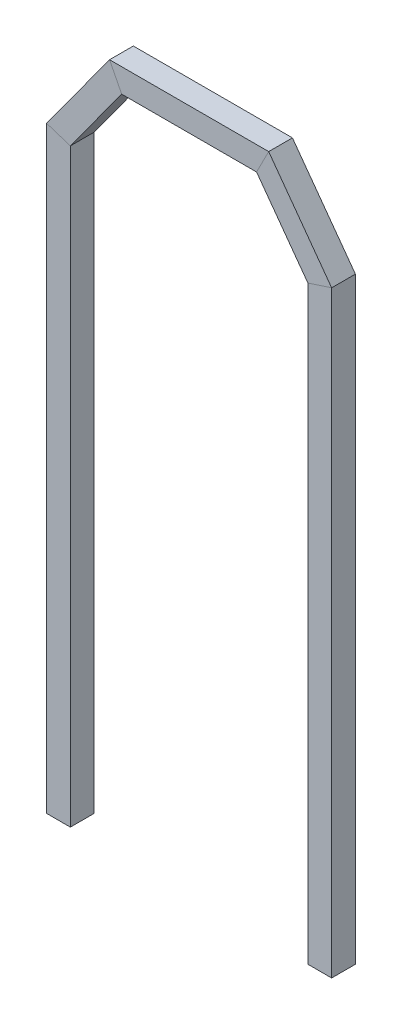
ISO-10303-21;
HEADER;
FILE_DESCRIPTION(('STEP AP214'),'2;1');
FILE_NAME('part.step','',(''),(''),'','','');
FILE_SCHEMA(('AUTOMOTIVE_DESIGN { 1 0 10303 214 1 1 1 1 }'));
ENDSEC;
DATA;
#1=APPLICATION_CONTEXT('core data for automotive mechanical design processes');
#2=APPLICATION_PROTOCOL_DEFINITION('international standard','automotive_design',2000,#1);
#3=PRODUCT_CONTEXT('',#1,'mechanical');
#4=PRODUCT('Part','Part','',(#3));
#5=PRODUCT_RELATED_PRODUCT_CATEGORY('part','',(#4));
#6=PRODUCT_DEFINITION_FORMATION('','',#4);
#7=PRODUCT_DEFINITION_CONTEXT('part definition',#1,'design');
#8=PRODUCT_DEFINITION('design','',#6,#7);
#9=PRODUCT_DEFINITION_SHAPE('','',#8);
#10=(LENGTH_UNIT() NAMED_UNIT(*) SI_UNIT(.MILLI.,.METRE.));
#11=(NAMED_UNIT(*) PLANE_ANGLE_UNIT() SI_UNIT($,.RADIAN.));
#12=(NAMED_UNIT(*) SI_UNIT($,.STERADIAN.) SOLID_ANGLE_UNIT());
#13=UNCERTAINTY_MEASURE_WITH_UNIT(LENGTH_MEASURE(1.E-05),#10,'distance_accuracy_value','');
#14=(GEOMETRIC_REPRESENTATION_CONTEXT(3) GLOBAL_UNCERTAINTY_ASSIGNED_CONTEXT((#13)) GLOBAL_UNIT_ASSIGNED_CONTEXT((#10,
#11,#12)) REPRESENTATION_CONTEXT('',''));
#15=CARTESIAN_POINT('',(0.,0.,0.));
#16=DIRECTION('',(0.,0.,1.));
#17=DIRECTION('',(1.,0.,0.));
#18=AXIS2_PLACEMENT_3D('',#15,#16,#17);
#19=CARTESIAN_POINT('',(202.567137450649,1728.2833819242,30.));
#20=DIRECTION('',(0.,1.,0.));
#21=DIRECTION('',(0.,0.,1.));
#22=AXIS2_PLACEMENT_3D('',#19,#20,#21);
#23=PLANE('',#22);
#24=DIRECTION('',(0.,0.,1.));
#25=VECTOR('',#24,1.);
#26=CARTESIAN_POINT('',(200.940228321157,1728.2833819242,30.));
#27=LINE('',#26,#25);
#28=CARTESIAN_POINT('',(200.940228321157,1728.2833819242,-30.));
#29=VERTEX_POINT('',#28);
#30=CARTESIAN_POINT('',(200.940228321157,1728.2833819242,30.));
#31=VERTEX_POINT('',#30);
#32=EDGE_CURVE('E169',#29,#31,#27,.T.);
#33=ORIENTED_EDGE('',*,*,#32,.F.);
#34=DIRECTION('',(-1.,0.,0.));
#35=VECTOR('',#34,1.);
#36=CARTESIAN_POINT('',(202.567137450649,1728.2833819242,-30.));
#37=LINE('',#36,#35);
#38=CARTESIAN_POINT('',(-200.940228321157,1728.2833819242,-30.));
#39=VERTEX_POINT('',#38);
#40=EDGE_CURVE('E127',#29,#39,#37,.T.);
#41=ORIENTED_EDGE('',*,*,#40,.T.);
#42=DIRECTION('',(0.,0.,-1.));
#43=VECTOR('',#42,1.);
#44=CARTESIAN_POINT('',(-200.940228321157,1728.2833819242,30.));
#45=LINE('',#44,#43);
#46=CARTESIAN_POINT('',(-200.940228321157,1728.2833819242,30.));
#47=VERTEX_POINT('',#46);
#48=EDGE_CURVE('E191',#47,#39,#45,.T.);
#49=ORIENTED_EDGE('',*,*,#48,.F.);
#50=DIRECTION('',(-1.,0.,0.));
#51=VECTOR('',#50,1.);
#52=CARTESIAN_POINT('',(202.567137450649,1728.2833819242,30.));
#53=LINE('',#52,#51);
#54=EDGE_CURVE('E43',#31,#47,#53,.T.);
#55=ORIENTED_EDGE('',*,*,#54,.F.);
#56=EDGE_LOOP('',(#33,#41,#49,#55));
#57=FACE_BOUND('',#56,.T.);
#58=ADVANCED_FACE('F39',(#57),#23,.T.);
#59=CARTESIAN_POINT('',(202.567137450649,1668.2833819242,-30.));
#60=DIRECTION('',(0.,0.,-1.));
#61=DIRECTION('',(-1.,0.,0.));
#62=AXIS2_PLACEMENT_3D('',#59,#60,#61);
#63=PLANE('',#62);
#64=DIRECTION('',(0.45359725722166,0.891206781976544,0.));
#65=VECTOR('',#64,1.);
#66=CARTESIAN_POINT('',(120.853534069389,1570.93277204523,-30.));
#67=LINE('',#66,#65);
#68=CARTESIAN_POINT('',(170.402045731321,1668.2833819242,-30.));
#69=VERTEX_POINT('',#68);
#70=EDGE_CURVE('E120',#69,#29,#67,.T.);
#71=ORIENTED_EDGE('',*,*,#70,.F.);
#72=DIRECTION('',(-1.,0.,0.));
#73=VECTOR('',#72,1.);
#74=CARTESIAN_POINT('',(202.567137450649,1668.2833819242,-30.));
#75=LINE('',#74,#73);
#76=CARTESIAN_POINT('',(-170.402045731321,1668.2833819242,-30.));
#77=VERTEX_POINT('',#76);
#78=EDGE_CURVE('E124',#69,#77,#75,.T.);
#79=ORIENTED_EDGE('',*,*,#78,.T.);
#80=DIRECTION('',(0.45359725722166,-0.891206781976544,0.));
#81=VECTOR('',#80,1.);
#82=CARTESIAN_POINT('',(-120.853534069389,1570.93277204523,-30.));
#83=LINE('',#82,#81);
#84=EDGE_CURVE('E197',#39,#77,#83,.T.);
#85=ORIENTED_EDGE('',*,*,#84,.F.);
#86=ORIENTED_EDGE('',*,*,#40,.F.);
#87=EDGE_LOOP('',(#71,#79,#85,#86));
#88=FACE_BOUND('',#87,.T.);
#89=ADVANCED_FACE('F121',(#88),#63,.T.);
#90=CARTESIAN_POINT('',(202.567137450649,1668.2833819242,30.));
#91=DIRECTION('',(0.,-1.,0.));
#92=DIRECTION('',(0.,0.,-1.));
#93=AXIS2_PLACEMENT_3D('',#90,#91,#92);
#94=PLANE('',#93);
#95=DIRECTION('',(0.,0.,-1.));
#96=VECTOR('',#95,1.);
#97=CARTESIAN_POINT('',(170.402045731321,1668.2833819242,30.));
#98=LINE('',#97,#96);
#99=CARTESIAN_POINT('',(170.402045731321,1668.2833819242,30.));
#100=VERTEX_POINT('',#99);
#101=EDGE_CURVE('E113',#100,#69,#98,.T.);
#102=ORIENTED_EDGE('',*,*,#101,.F.);
#103=DIRECTION('',(-1.,0.,0.));
#104=VECTOR('',#103,1.);
#105=CARTESIAN_POINT('',(202.567137450649,1668.2833819242,30.));
#106=LINE('',#105,#104);
#107=CARTESIAN_POINT('',(-170.402045731321,1668.2833819242,30.));
#108=VERTEX_POINT('',#107);
#109=EDGE_CURVE('E140',#100,#108,#106,.T.);
#110=ORIENTED_EDGE('',*,*,#109,.T.);
#111=DIRECTION('',(0.,0.,1.));
#112=VECTOR('',#111,1.);
#113=CARTESIAN_POINT('',(-170.402045731321,1668.2833819242,30.));
#114=LINE('',#113,#112);
#115=EDGE_CURVE('E137',#77,#108,#114,.T.);
#116=ORIENTED_EDGE('',*,*,#115,.F.);
#117=ORIENTED_EDGE('',*,*,#78,.F.);
#118=EDGE_LOOP('',(#102,#110,#116,#117));
#119=FACE_BOUND('',#118,.T.);
#120=ADVANCED_FACE('F135',(#119),#94,.T.);
#121=CARTESIAN_POINT('',(202.567137450649,1668.2833819242,30.));
#122=DIRECTION('',(0.,0.,1.));
#123=DIRECTION('',(1.,0.,0.));
#124=AXIS2_PLACEMENT_3D('',#121,#122,#123);
#125=PLANE('',#124);
#126=DIRECTION('',(-0.45359725722166,-0.891206781976544,0.));
#127=VECTOR('',#126,1.);
#128=CARTESIAN_POINT('',(120.853534069389,1570.93277204523,30.));
#129=LINE('',#128,#127);
#130=EDGE_CURVE('E151',#31,#100,#129,.T.);
#131=ORIENTED_EDGE('',*,*,#130,.F.);
#132=ORIENTED_EDGE('',*,*,#54,.T.);
#133=DIRECTION('',(-0.45359725722166,0.891206781976544,0.));
#134=VECTOR('',#133,1.);
#135=CARTESIAN_POINT('',(-120.853534069389,1570.93277204523,30.));
#136=LINE('',#135,#134);
#137=EDGE_CURVE('E187',#108,#47,#136,.T.);
#138=ORIENTED_EDGE('',*,*,#137,.F.);
#139=ORIENTED_EDGE('',*,*,#109,.F.);
#140=EDGE_LOOP('',(#131,#132,#138,#139));
#141=FACE_BOUND('',#140,.T.);
#142=ADVANCED_FACE('F41',(#141),#125,.T.);
#143=CARTESIAN_POINT('',(312.123481963488,1473.58216216625,30.));
#144=DIRECTION('',(0.,0.,1.));
#145=DIRECTION('',(1.,0.,0.));
#146=AXIS2_PLACEMENT_3D('',#143,#144,#145);
#147=PLANE('',#146);
#148=DIRECTION('',(-0.588499056481974,0.808497903843805,0.));
#149=VECTOR('',#148,1.);
#150=CARTESIAN_POINT('',(360.633356194117,1508.89210555517,30.));
#151=LINE('',#150,#149);
#152=CARTESIAN_POINT('',(360.,1509.76222955909,30.));
#153=VERTEX_POINT('',#152);
#154=EDGE_CURVE('E161',#153,#31,#151,.T.);
#155=ORIENTED_EDGE('',*,*,#154,.T.);
#156=ORIENTED_EDGE('',*,*,#130,.T.);
#157=DIRECTION('',(-0.588499056481974,0.808497903843805,0.));
#158=VECTOR('',#157,1.);
#159=CARTESIAN_POINT('',(312.123481963488,1473.58216216625,30.));
#160=LINE('',#159,#158);
#161=CARTESIAN_POINT('',(300.,1490.23777044091,30.));
#162=VERTEX_POINT('',#161);
#163=EDGE_CURVE('E149',#162,#100,#160,.T.);
#164=ORIENTED_EDGE('',*,*,#163,.F.);
#165=DIRECTION('',(-0.95092005548411,-0.309436662466,0.));
#166=VECTOR('',#165,1.);
#167=CARTESIAN_POINT('',(-138.501760919138,1347.54594203562,30.));
#168=LINE('',#167,#166);
#169=EDGE_CURVE('E336',#153,#162,#168,.T.);
#170=ORIENTED_EDGE('',*,*,#169,.F.);
#171=EDGE_LOOP('',(#155,#156,#164,#170));
#172=FACE_BOUND('',#171,.T.);
#173=ADVANCED_FACE('F360',(#172),#147,.T.);
#174=CARTESIAN_POINT('',(312.123481963488,1473.58216216625,30.));
#175=DIRECTION('',(-0.808497903843805,-0.588499056481974,0.));
#176=DIRECTION('',(0.588499056481974,-0.808497903843805,0.));
#177=AXIS2_PLACEMENT_3D('',#174,#175,#176);
#178=PLANE('',#177);
#179=ORIENTED_EDGE('',*,*,#163,.T.);
#180=ORIENTED_EDGE('',*,*,#101,.T.);
#181=DIRECTION('',(-0.588499056481974,0.808497903843805,0.));
#182=VECTOR('',#181,1.);
#183=CARTESIAN_POINT('',(312.123481963488,1473.58216216625,-30.));
#184=LINE('',#183,#182);
#185=CARTESIAN_POINT('',(300.,1490.23777044091,-30.));
#186=VERTEX_POINT('',#185);
#187=EDGE_CURVE('E146',#186,#69,#184,.T.);
#188=ORIENTED_EDGE('',*,*,#187,.F.);
#189=DIRECTION('',(0.,0.,-1.));
#190=VECTOR('',#189,1.);
#191=CARTESIAN_POINT('',(300.,1490.23777044091,30.));
#192=LINE('',#191,#190);
#193=EDGE_CURVE('E333',#162,#186,#192,.T.);
#194=ORIENTED_EDGE('',*,*,#193,.F.);
#195=EDGE_LOOP('',(#179,#180,#188,#194));
#196=FACE_BOUND('',#195,.T.);
#197=ADVANCED_FACE('F145',(#196),#178,.T.);
#198=CARTESIAN_POINT('',(312.123481963488,1473.58216216625,-30.));
#199=DIRECTION('',(0.,0.,-1.));
#200=DIRECTION('',(-1.,0.,0.));
#201=AXIS2_PLACEMENT_3D('',#198,#199,#200);
#202=PLANE('',#201);
#203=ORIENTED_EDGE('',*,*,#187,.T.);
#204=ORIENTED_EDGE('',*,*,#70,.T.);
#205=DIRECTION('',(-0.588499056481974,0.808497903843805,0.));
#206=VECTOR('',#205,1.);
#207=CARTESIAN_POINT('',(360.633356194117,1508.89210555517,-30.));
#208=LINE('',#207,#206);
#209=CARTESIAN_POINT('',(360.,1509.76222955909,-30.));
#210=VERTEX_POINT('',#209);
#211=EDGE_CURVE('E157',#210,#29,#208,.T.);
#212=ORIENTED_EDGE('',*,*,#211,.F.);
#213=DIRECTION('',(0.95092005548411,0.309436662466,0.));
#214=VECTOR('',#213,1.);
#215=CARTESIAN_POINT('',(-138.501760919138,1347.54594203562,-30.));
#216=LINE('',#215,#214);
#217=EDGE_CURVE('E155',#186,#210,#216,.T.);
#218=ORIENTED_EDGE('',*,*,#217,.F.);
#219=EDGE_LOOP('',(#203,#204,#212,#218));
#220=FACE_BOUND('',#219,.T.);
#221=ADVANCED_FACE('F153',(#220),#202,.T.);
#222=CARTESIAN_POINT('',(360.633356194117,1508.89210555517,30.));
#223=DIRECTION('',(0.808497903843805,0.588499056481974,0.));
#224=DIRECTION('',(-0.588499056481974,0.808497903843805,0.));
#225=AXIS2_PLACEMENT_3D('',#222,#223,#224);
#226=PLANE('',#225);
#227=ORIENTED_EDGE('',*,*,#211,.T.);
#228=ORIENTED_EDGE('',*,*,#32,.T.);
#229=ORIENTED_EDGE('',*,*,#154,.F.);
#230=DIRECTION('',(0.,0.,1.));
#231=VECTOR('',#230,1.);
#232=CARTESIAN_POINT('',(360.,1509.76222955909,30.));
#233=LINE('',#232,#231);
#234=EDGE_CURVE('E340',#210,#153,#233,.T.);
#235=ORIENTED_EDGE('',*,*,#234,.F.);
#236=EDGE_LOOP('',(#227,#228,#229,#235));
#237=FACE_BOUND('',#236,.T.);
#238=ADVANCED_FACE('F363',(#237),#226,.T.);
#239=CARTESIAN_POINT('',(300.,0.,30.));
#240=DIRECTION('',(0.,0.,1.));
#241=DIRECTION('',(1.,0.,0.));
#242=AXIS2_PLACEMENT_3D('',#239,#240,#241);
#243=PLANE('',#242);
#244=DIRECTION('',(0.,1.,0.));
#245=VECTOR('',#244,1.);
#246=CARTESIAN_POINT('',(360.,0.,30.));
#247=LINE('',#246,#245);
#248=CARTESIAN_POINT('',(360.,0.,30.));
#249=VERTEX_POINT('',#248);
#250=EDGE_CURVE('E133',#249,#153,#247,.T.);
#251=ORIENTED_EDGE('',*,*,#250,.T.);
#252=ORIENTED_EDGE('',*,*,#169,.T.);
#253=DIRECTION('',(0.,1.,0.));
#254=VECTOR('',#253,1.);
#255=CARTESIAN_POINT('',(300.,0.,30.));
#256=LINE('',#255,#254);
#257=CARTESIAN_POINT('',(300.,0.,30.));
#258=VERTEX_POINT('',#257);
#259=EDGE_CURVE('E352',#258,#162,#256,.T.);
#260=ORIENTED_EDGE('',*,*,#259,.F.);
#261=DIRECTION('',(1.,0.,0.));
#262=VECTOR('',#261,1.);
#263=CARTESIAN_POINT('',(300.,0.,30.));
#264=LINE('',#263,#262);
#265=EDGE_CURVE('E309',#258,#249,#264,.T.);
#266=ORIENTED_EDGE('',*,*,#265,.T.);
#267=EDGE_LOOP('',(#251,#252,#260,#266));
#268=FACE_BOUND('',#267,.T.);
#269=ADVANCED_FACE('F370',(#268),#243,.T.);
#270=CARTESIAN_POINT('',(300.,0.,30.));
#271=DIRECTION('',(-1.,0.,0.));
#272=DIRECTION('',(0.,0.,1.));
#273=AXIS2_PLACEMENT_3D('',#270,#271,#272);
#274=PLANE('',#273);
#275=ORIENTED_EDGE('',*,*,#259,.T.);
#276=ORIENTED_EDGE('',*,*,#193,.T.);
#277=DIRECTION('',(0.,1.,0.));
#278=VECTOR('',#277,1.);
#279=CARTESIAN_POINT('',(300.,0.,-30.));
#280=LINE('',#279,#278);
#281=CARTESIAN_POINT('',(300.,0.,-30.));
#282=VERTEX_POINT('',#281);
#283=EDGE_CURVE('E345',#282,#186,#280,.T.);
#284=ORIENTED_EDGE('',*,*,#283,.F.);
#285=DIRECTION('',(0.,0.,1.));
#286=VECTOR('',#285,1.);
#287=CARTESIAN_POINT('',(300.,0.,30.));
#288=LINE('',#287,#286);
#289=EDGE_CURVE('E322',#282,#258,#288,.T.);
#290=ORIENTED_EDGE('',*,*,#289,.T.);
#291=EDGE_LOOP('',(#275,#276,#284,#290));
#292=FACE_BOUND('',#291,.T.);
#293=ADVANCED_FACE('F382',(#292),#274,.T.);
#294=CARTESIAN_POINT('',(300.,0.,-30.));
#295=DIRECTION('',(0.,0.,-1.));
#296=DIRECTION('',(-1.,0.,0.));
#297=AXIS2_PLACEMENT_3D('',#294,#295,#296);
#298=PLANE('',#297);
#299=ORIENTED_EDGE('',*,*,#283,.T.);
#300=ORIENTED_EDGE('',*,*,#217,.T.);
#301=DIRECTION('',(0.,1.,0.));
#302=VECTOR('',#301,1.);
#303=CARTESIAN_POINT('',(360.,0.,-30.));
#304=LINE('',#303,#302);
#305=CARTESIAN_POINT('',(360.,0.,-30.));
#306=VERTEX_POINT('',#305);
#307=EDGE_CURVE('E341',#306,#210,#304,.T.);
#308=ORIENTED_EDGE('',*,*,#307,.F.);
#309=DIRECTION('',(-1.,0.,0.));
#310=VECTOR('',#309,1.);
#311=CARTESIAN_POINT('',(300.,0.,-30.));
#312=LINE('',#311,#310);
#313=EDGE_CURVE('E326',#306,#282,#312,.T.);
#314=ORIENTED_EDGE('',*,*,#313,.T.);
#315=EDGE_LOOP('',(#299,#300,#308,#314));
#316=FACE_BOUND('',#315,.T.);
#317=ADVANCED_FACE('F379',(#316),#298,.T.);
#318=CARTESIAN_POINT('',(360.,0.,30.));
#319=DIRECTION('',(1.,0.,0.));
#320=DIRECTION('',(0.,0.,-1.));
#321=AXIS2_PLACEMENT_3D('',#318,#319,#320);
#322=PLANE('',#321);
#323=ORIENTED_EDGE('',*,*,#307,.T.);
#324=ORIENTED_EDGE('',*,*,#234,.T.);
#325=ORIENTED_EDGE('',*,*,#250,.F.);
#326=DIRECTION('',(0.,0.,-1.));
#327=VECTOR('',#326,1.);
#328=CARTESIAN_POINT('',(360.,0.,30.));
#329=LINE('',#328,#327);
#330=EDGE_CURVE('E323',#249,#306,#329,.T.);
#331=ORIENTED_EDGE('',*,*,#330,.T.);
#332=EDGE_LOOP('',(#323,#324,#325,#331));
#333=FACE_BOUND('',#332,.T.);
#334=ADVANCED_FACE('F366',(#333),#322,.T.);
#335=CARTESIAN_POINT('',(0.,0.,0.));
#336=DIRECTION('',(0.,-1.,0.));
#337=DIRECTION('',(0.,0.,-1.));
#338=AXIS2_PLACEMENT_3D('',#335,#336,#337);
#339=PLANE('',#338);
#340=ORIENTED_EDGE('',*,*,#330,.F.);
#341=ORIENTED_EDGE('',*,*,#265,.F.);
#342=ORIENTED_EDGE('',*,*,#289,.F.);
#343=ORIENTED_EDGE('',*,*,#313,.F.);
#344=EDGE_LOOP('',(#340,#341,#342,#343));
#345=FACE_BOUND('',#344,.T.);
#346=DIRECTION('',(1.,0.,0.));
#347=VECTOR('',#346,1.);
#348=CARTESIAN_POINT('',(305.,0.,25.));
#349=LINE('',#348,#347);
#350=CARTESIAN_POINT('',(355.,0.,25.));
#351=VERTEX_POINT('',#350);
#352=CARTESIAN_POINT('',(305.,0.,25.));
#353=VERTEX_POINT('',#352);
#354=EDGE_CURVE('E252',#351,#353,#349,.F.);
#355=ORIENTED_EDGE('',*,*,#354,.F.);
#356=DIRECTION('',(0.,0.,-1.));
#357=VECTOR('',#356,1.);
#358=CARTESIAN_POINT('',(355.,0.,25.));
#359=LINE('',#358,#357);
#360=CARTESIAN_POINT('',(355.,0.,-25.));
#361=VERTEX_POINT('',#360);
#362=EDGE_CURVE('E256',#361,#351,#359,.F.);
#363=ORIENTED_EDGE('',*,*,#362,.F.);
#364=DIRECTION('',(-1.,0.,0.));
#365=VECTOR('',#364,1.);
#366=CARTESIAN_POINT('',(305.,0.,-25.));
#367=LINE('',#366,#365);
#368=CARTESIAN_POINT('',(305.,0.,-25.));
#369=VERTEX_POINT('',#368);
#370=EDGE_CURVE('E241',#369,#361,#367,.F.);
#371=ORIENTED_EDGE('',*,*,#370,.F.);
#372=DIRECTION('',(0.,0.,1.));
#373=VECTOR('',#372,1.);
#374=CARTESIAN_POINT('',(305.,0.,25.));
#375=LINE('',#374,#373);
#376=EDGE_CURVE('E237',#353,#369,#375,.F.);
#377=ORIENTED_EDGE('',*,*,#376,.F.);
#378=EDGE_LOOP('',(#355,#363,#371,#377));
#379=FACE_BOUND('',#378,.T.);
#380=ADVANCED_FACE('F375',(#345,#379),#339,.T.);
#381=CARTESIAN_POINT('',(199.76780404658,1673.2833819242,25.));
#382=DIRECTION('',(0.,1.,0.));
#383=DIRECTION('',(0.,0.,1.));
#384=AXIS2_PLACEMENT_3D('',#381,#382,#383);
#385=PLANE('',#384);
#386=DIRECTION('',(0.,0.,1.));
#387=VECTOR('',#386,1.);
#388=CARTESIAN_POINT('',(172.946894280474,1673.2833819242,25.));
#389=LINE('',#388,#387);
#390=CARTESIAN_POINT('',(172.946894280474,1673.2833819242,-25.));
#391=VERTEX_POINT('',#390);
#392=CARTESIAN_POINT('',(172.946894280474,1673.2833819242,25.));
#393=VERTEX_POINT('',#392);
#394=EDGE_CURVE('E284',#391,#393,#389,.T.);
#395=ORIENTED_EDGE('',*,*,#394,.F.);
#396=DIRECTION('',(-1.,0.,0.));
#397=VECTOR('',#396,1.);
#398=CARTESIAN_POINT('',(199.76780404658,1673.2833819242,-25.));
#399=LINE('',#398,#397);
#400=CARTESIAN_POINT('',(-172.946894280474,1673.2833819242,-25.));
#401=VERTEX_POINT('',#400);
#402=EDGE_CURVE('E313',#391,#401,#399,.T.);
#403=ORIENTED_EDGE('',*,*,#402,.T.);
#404=DIRECTION('',(0.,0.,-1.));
#405=VECTOR('',#404,1.);
#406=CARTESIAN_POINT('',(-172.946894280474,1673.2833819242,25.));
#407=LINE('',#406,#405);
#408=CARTESIAN_POINT('',(-172.946894280474,1673.2833819242,25.));
#409=VERTEX_POINT('',#408);
#410=EDGE_CURVE('E830',#409,#401,#407,.T.);
#411=ORIENTED_EDGE('',*,*,#410,.F.);
#412=DIRECTION('',(-1.,0.,0.));
#413=VECTOR('',#412,1.);
#414=CARTESIAN_POINT('',(199.76780404658,1673.2833819242,25.));
#415=LINE('',#414,#413);
#416=EDGE_CURVE('E290',#393,#409,#415,.T.);
#417=ORIENTED_EDGE('',*,*,#416,.F.);
#418=EDGE_LOOP('',(#395,#403,#411,#417));
#419=FACE_BOUND('',#418,.T.);
#420=ADVANCED_FACE('F429',(#419),#385,.T.);
#421=CARTESIAN_POINT('',(199.76780404658,1673.2833819242,-25.));
#422=DIRECTION('',(0.,0.,1.));
#423=DIRECTION('',(1.,0.,0.));
#424=AXIS2_PLACEMENT_3D('',#421,#422,#423);
#425=PLANE('',#424);
#426=DIRECTION('',(-0.45359725722166,-0.891206781976544,0.));
#427=VECTOR('',#426,1.);
#428=CARTESIAN_POINT('',(123.243019107486,1575.62752104884,-25.));
#429=LINE('',#428,#427);
#430=CARTESIAN_POINT('',(198.395379772004,1723.2833819242,-25.));
#431=VERTEX_POINT('',#430);
#432=EDGE_CURVE('E242',#431,#391,#429,.T.);
#433=ORIENTED_EDGE('',*,*,#432,.F.);
#434=DIRECTION('',(-1.,0.,0.));
#435=VECTOR('',#434,1.);
#436=CARTESIAN_POINT('',(199.76780404658,1723.2833819242,-25.));
#437=LINE('',#436,#435);
#438=CARTESIAN_POINT('',(-198.395379772004,1723.2833819242,-25.));
#439=VERTEX_POINT('',#438);
#440=EDGE_CURVE('E308',#431,#439,#437,.T.);
#441=ORIENTED_EDGE('',*,*,#440,.T.);
#442=DIRECTION('',(-0.45359725722166,0.891206781976544,0.));
#443=VECTOR('',#442,1.);
#444=CARTESIAN_POINT('',(-123.243019107486,1575.62752104884,-25.));
#445=LINE('',#444,#443);
#446=EDGE_CURVE('E826',#401,#439,#445,.T.);
#447=ORIENTED_EDGE('',*,*,#446,.F.);
#448=ORIENTED_EDGE('',*,*,#402,.F.);
#449=EDGE_LOOP('',(#433,#441,#447,#448));
#450=FACE_BOUND('',#449,.T.);
#451=ADVANCED_FACE('F432',(#450),#425,.T.);
#452=CARTESIAN_POINT('',(199.76780404658,1723.2833819242,25.));
#453=DIRECTION('',(0.,-1.,0.));
#454=DIRECTION('',(0.,0.,-1.));
#455=AXIS2_PLACEMENT_3D('',#452,#453,#454);
#456=PLANE('',#455);
#457=DIRECTION('',(0.,0.,-1.));
#458=VECTOR('',#457,1.);
#459=CARTESIAN_POINT('',(198.395379772004,1723.2833819242,25.));
#460=LINE('',#459,#458);
#461=CARTESIAN_POINT('',(198.395379772004,1723.2833819242,25.));
#462=VERTEX_POINT('',#461);
#463=EDGE_CURVE('E276',#462,#431,#460,.T.);
#464=ORIENTED_EDGE('',*,*,#463,.F.);
#465=DIRECTION('',(-1.,0.,0.));
#466=VECTOR('',#465,1.);
#467=CARTESIAN_POINT('',(199.76780404658,1723.2833819242,25.));
#468=LINE('',#467,#466);
#469=CARTESIAN_POINT('',(-198.395379772004,1723.2833819242,25.));
#470=VERTEX_POINT('',#469);
#471=EDGE_CURVE('E304',#462,#470,#468,.T.);
#472=ORIENTED_EDGE('',*,*,#471,.T.);
#473=DIRECTION('',(0.,0.,1.));
#474=VECTOR('',#473,1.);
#475=CARTESIAN_POINT('',(-198.395379772004,1723.2833819242,25.));
#476=LINE('',#475,#474);
#477=EDGE_CURVE('E838',#439,#470,#476,.T.);
#478=ORIENTED_EDGE('',*,*,#477,.F.);
#479=ORIENTED_EDGE('',*,*,#440,.F.);
#480=EDGE_LOOP('',(#464,#472,#478,#479));
#481=FACE_BOUND('',#480,.T.);
#482=ADVANCED_FACE('F436',(#481),#456,.T.);
#483=CARTESIAN_POINT('',(199.76780404658,1673.2833819242,25.));
#484=DIRECTION('',(0.,0.,-1.));
#485=DIRECTION('',(-1.,0.,0.));
#486=AXIS2_PLACEMENT_3D('',#483,#484,#485);
#487=PLANE('',#486);
#488=DIRECTION('',(0.45359725722166,0.891206781976544,0.));
#489=VECTOR('',#488,1.);
#490=CARTESIAN_POINT('',(123.243019107486,1575.62752104884,25.));
#491=LINE('',#490,#489);
#492=EDGE_CURVE('E280',#393,#462,#491,.T.);
#493=ORIENTED_EDGE('',*,*,#492,.F.);
#494=ORIENTED_EDGE('',*,*,#416,.T.);
#495=DIRECTION('',(0.45359725722166,-0.891206781976544,0.));
#496=VECTOR('',#495,1.);
#497=CARTESIAN_POINT('',(-123.243019107486,1575.62752104884,25.));
#498=LINE('',#497,#496);
#499=EDGE_CURVE('E834',#470,#409,#498,.T.);
#500=ORIENTED_EDGE('',*,*,#499,.F.);
#501=ORIENTED_EDGE('',*,*,#471,.F.);
#502=EDGE_LOOP('',(#493,#494,#500,#501));
#503=FACE_BOUND('',#502,.T.);
#504=ADVANCED_FACE('F427',(#503),#487,.T.);
#505=CARTESIAN_POINT('',(315.112709953848,1477.97166017348,25.));
#506=DIRECTION('',(0.,0.,-1.));
#507=DIRECTION('',(-1.,0.,0.));
#508=AXIS2_PLACEMENT_3D('',#505,#506,#507);
#509=PLANE('',#508);
#510=DIRECTION('',(-0.588499056481974,0.808497903843805,0.));
#511=VECTOR('',#510,1.);
#512=CARTESIAN_POINT('',(315.112709953848,1477.97166017348,25.));
#513=LINE('',#512,#511);
#514=CARTESIAN_POINT('',(305.,1491.86480870076,25.));
#515=VERTEX_POINT('',#514);
#516=EDGE_CURVE('E297',#515,#393,#513,.T.);
#517=ORIENTED_EDGE('',*,*,#516,.T.);
#518=ORIENTED_EDGE('',*,*,#492,.T.);
#519=DIRECTION('',(-0.588499056481974,0.808497903843805,0.));
#520=VECTOR('',#519,1.);
#521=CARTESIAN_POINT('',(355.537605146039,1507.39661299758,25.));
#522=LINE('',#521,#520);
#523=CARTESIAN_POINT('',(355.,1508.13519129924,25.));
#524=VERTEX_POINT('',#523);
#525=EDGE_CURVE('E285',#524,#462,#522,.T.);
#526=ORIENTED_EDGE('',*,*,#525,.F.);
#527=DIRECTION('',(0.95092005548411,0.309436662466,0.));
#528=VECTOR('',#527,1.);
#529=CARTESIAN_POINT('',(-133.980516159528,1349.01718967683,25.));
#530=LINE('',#529,#528);
#531=EDGE_CURVE('E232',#515,#524,#530,.T.);
#532=ORIENTED_EDGE('',*,*,#531,.F.);
#533=EDGE_LOOP('',(#517,#518,#526,#532));
#534=FACE_BOUND('',#533,.T.);
#535=ADVANCED_FACE('F423',(#534),#509,.T.);
#536=CARTESIAN_POINT('',(355.537605146039,1507.39661299758,25.));
#537=DIRECTION('',(-0.808497903843805,-0.588499056481974,0.));
#538=DIRECTION('',(0.588499056481974,-0.808497903843805,0.));
#539=AXIS2_PLACEMENT_3D('',#536,#537,#538);
#540=PLANE('',#539);
#541=ORIENTED_EDGE('',*,*,#525,.T.);
#542=ORIENTED_EDGE('',*,*,#463,.T.);
#543=DIRECTION('',(-0.588499056481974,0.808497903843805,0.));
#544=VECTOR('',#543,1.);
#545=CARTESIAN_POINT('',(355.537605146039,1507.39661299758,-25.));
#546=LINE('',#545,#544);
#547=CARTESIAN_POINT('',(355.,1508.13519129924,-25.));
#548=VERTEX_POINT('',#547);
#549=EDGE_CURVE('E289',#548,#431,#546,.T.);
#550=ORIENTED_EDGE('',*,*,#549,.F.);
#551=DIRECTION('',(0.,0.,-1.));
#552=VECTOR('',#551,1.);
#553=CARTESIAN_POINT('',(355.,1508.13519129924,25.));
#554=LINE('',#553,#552);
#555=EDGE_CURVE('E50',#524,#548,#554,.T.);
#556=ORIENTED_EDGE('',*,*,#555,.F.);
#557=EDGE_LOOP('',(#541,#542,#550,#556));
#558=FACE_BOUND('',#557,.T.);
#559=ADVANCED_FACE('F420',(#558),#540,.T.);
#560=CARTESIAN_POINT('',(315.112709953848,1477.97166017348,-25.));
#561=DIRECTION('',(0.,0.,1.));
#562=DIRECTION('',(1.,0.,0.));
#563=AXIS2_PLACEMENT_3D('',#560,#561,#562);
#564=PLANE('',#563);
#565=ORIENTED_EDGE('',*,*,#549,.T.);
#566=ORIENTED_EDGE('',*,*,#432,.T.);
#567=DIRECTION('',(-0.588499056481974,0.808497903843805,0.));
#568=VECTOR('',#567,1.);
#569=CARTESIAN_POINT('',(315.112709953848,1477.97166017348,-25.));
#570=LINE('',#569,#568);
#571=CARTESIAN_POINT('',(305.,1491.86480870076,-25.));
#572=VERTEX_POINT('',#571);
#573=EDGE_CURVE('E293',#572,#391,#570,.T.);
#574=ORIENTED_EDGE('',*,*,#573,.F.);
#575=DIRECTION('',(-0.95092005548411,-0.309436662466,0.));
#576=VECTOR('',#575,1.);
#577=CARTESIAN_POINT('',(-133.980516159528,1349.01718967683,-25.));
#578=LINE('',#577,#576);
#579=EDGE_CURVE('E11',#548,#572,#578,.T.);
#580=ORIENTED_EDGE('',*,*,#579,.F.);
#581=EDGE_LOOP('',(#565,#566,#574,#580));
#582=FACE_BOUND('',#581,.T.);
#583=ADVANCED_FACE('F416',(#582),#564,.T.);
#584=CARTESIAN_POINT('',(315.112709953848,1477.97166017348,25.));
#585=DIRECTION('',(0.808497903843805,0.588499056481974,0.));
#586=DIRECTION('',(-0.588499056481974,0.808497903843805,0.));
#587=AXIS2_PLACEMENT_3D('',#584,#585,#586);
#588=PLANE('',#587);
#589=ORIENTED_EDGE('',*,*,#573,.T.);
#590=ORIENTED_EDGE('',*,*,#394,.T.);
#591=ORIENTED_EDGE('',*,*,#516,.F.);
#592=DIRECTION('',(0.,0.,1.));
#593=VECTOR('',#592,1.);
#594=CARTESIAN_POINT('',(305.,1491.86480870076,25.));
#595=LINE('',#594,#593);
#596=EDGE_CURVE('E236',#572,#515,#595,.T.);
#597=ORIENTED_EDGE('',*,*,#596,.F.);
#598=EDGE_LOOP('',(#589,#590,#591,#597));
#599=FACE_BOUND('',#598,.T.);
#600=ADVANCED_FACE('F412',(#599),#588,.T.);
#601=CARTESIAN_POINT('',(305.,0.,25.));
#602=DIRECTION('',(0.,0.,-1.));
#603=DIRECTION('',(-1.,0.,0.));
#604=AXIS2_PLACEMENT_3D('',#601,#602,#603);
#605=PLANE('',#604);
#606=DIRECTION('',(0.,1.,0.));
#607=VECTOR('',#606,1.);
#608=CARTESIAN_POINT('',(305.,0.,25.));
#609=LINE('',#608,#607);
#610=EDGE_CURVE('E248',#353,#515,#609,.T.);
#611=ORIENTED_EDGE('',*,*,#610,.T.);
#612=ORIENTED_EDGE('',*,*,#531,.T.);
#613=DIRECTION('',(0.,1.,0.));
#614=VECTOR('',#613,1.);
#615=CARTESIAN_POINT('',(355.,0.,25.));
#616=LINE('',#615,#614);
#617=EDGE_CURVE('E260',#351,#524,#616,.T.);
#618=ORIENTED_EDGE('',*,*,#617,.F.);
#619=ORIENTED_EDGE('',*,*,#354,.T.);
#620=EDGE_LOOP('',(#611,#612,#618,#619));
#621=FACE_BOUND('',#620,.T.);
#622=ADVANCED_FACE('F408',(#621),#605,.T.);
#623=CARTESIAN_POINT('',(355.,0.,25.));
#624=DIRECTION('',(-1.,0.,0.));
#625=DIRECTION('',(0.,0.,1.));
#626=AXIS2_PLACEMENT_3D('',#623,#624,#625);
#627=PLANE('',#626);
#628=ORIENTED_EDGE('',*,*,#617,.T.);
#629=ORIENTED_EDGE('',*,*,#555,.T.);
#630=DIRECTION('',(0.,1.,0.));
#631=VECTOR('',#630,1.);
#632=CARTESIAN_POINT('',(355.,0.,-25.));
#633=LINE('',#632,#631);
#634=EDGE_CURVE('E247',#361,#548,#633,.T.);
#635=ORIENTED_EDGE('',*,*,#634,.F.);
#636=ORIENTED_EDGE('',*,*,#362,.T.);
#637=EDGE_LOOP('',(#628,#629,#635,#636));
#638=FACE_BOUND('',#637,.T.);
#639=ADVANCED_FACE('F401',(#638),#627,.T.);
#640=CARTESIAN_POINT('',(305.,0.,-25.));
#641=DIRECTION('',(0.,0.,1.));
#642=DIRECTION('',(1.,0.,0.));
#643=AXIS2_PLACEMENT_3D('',#640,#641,#642);
#644=PLANE('',#643);
#645=ORIENTED_EDGE('',*,*,#634,.T.);
#646=ORIENTED_EDGE('',*,*,#579,.T.);
#647=DIRECTION('',(0.,1.,0.));
#648=VECTOR('',#647,1.);
#649=CARTESIAN_POINT('',(305.,0.,-25.));
#650=LINE('',#649,#648);
#651=EDGE_CURVE('E243',#369,#572,#650,.T.);
#652=ORIENTED_EDGE('',*,*,#651,.F.);
#653=ORIENTED_EDGE('',*,*,#370,.T.);
#654=EDGE_LOOP('',(#645,#646,#652,#653));
#655=FACE_BOUND('',#654,.T.);
#656=ADVANCED_FACE('F393',(#655),#644,.T.);
#657=CARTESIAN_POINT('',(305.,0.,25.));
#658=DIRECTION('',(1.,0.,0.));
#659=DIRECTION('',(0.,0.,-1.));
#660=AXIS2_PLACEMENT_3D('',#657,#658,#659);
#661=PLANE('',#660);
#662=ORIENTED_EDGE('',*,*,#651,.T.);
#663=ORIENTED_EDGE('',*,*,#596,.T.);
#664=ORIENTED_EDGE('',*,*,#610,.F.);
#665=ORIENTED_EDGE('',*,*,#376,.T.);
#666=EDGE_LOOP('',(#662,#663,#664,#665));
#667=FACE_BOUND('',#666,.T.);
#668=ADVANCED_FACE('F391',(#667),#661,.T.);
#669=CARTESIAN_POINT('',(-312.123481963488,1473.58216216625,30.));
#670=DIRECTION('',(0.,0.,1.));
#671=DIRECTION('',(1.,0.,0.));
#672=AXIS2_PLACEMENT_3D('',#669,#670,#671);
#673=PLANE('',#672);
#674=DIRECTION('',(0.588499056481974,0.808497903843805,0.));
#675=VECTOR('',#674,1.);
#676=CARTESIAN_POINT('',(-312.123481963488,1473.58216216625,30.));
#677=LINE('',#676,#675);
#678=CARTESIAN_POINT('',(-300.,1490.23777044091,30.));
#679=VERTEX_POINT('',#678);
#680=EDGE_CURVE('E208',#679,#108,#677,.T.);
#681=ORIENTED_EDGE('',*,*,#680,.T.);
#682=ORIENTED_EDGE('',*,*,#137,.T.);
#683=DIRECTION('',(0.588499056481974,0.808497903843805,0.));
#684=VECTOR('',#683,1.);
#685=CARTESIAN_POINT('',(-360.633356194117,1508.89210555517,30.));
#686=LINE('',#685,#684);
#687=CARTESIAN_POINT('',(-360.,1509.76222955909,30.));
#688=VERTEX_POINT('',#687);
#689=EDGE_CURVE('E205',#688,#47,#686,.T.);
#690=ORIENTED_EDGE('',*,*,#689,.F.);
#691=DIRECTION('',(-0.95092005548411,0.309436662466,0.));
#692=VECTOR('',#691,1.);
#693=CARTESIAN_POINT('',(138.501760919138,1347.54594203562,30.));
#694=LINE('',#693,#692);
#695=EDGE_CURVE('E880',#679,#688,#694,.T.);
#696=ORIENTED_EDGE('',*,*,#695,.F.);
#697=EDGE_LOOP('',(#681,#682,#690,#696));
#698=FACE_BOUND('',#697,.T.);
#699=ADVANCED_FACE('F202',(#698),#673,.T.);
#700=CARTESIAN_POINT('',(-360.633356194117,1508.89210555517,30.));
#701=DIRECTION('',(-0.808497903843805,0.588499056481974,0.));
#702=DIRECTION('',(-0.588499056481974,-0.808497903843805,0.));
#703=AXIS2_PLACEMENT_3D('',#700,#701,#702);
#704=PLANE('',#703);
#705=ORIENTED_EDGE('',*,*,#689,.T.);
#706=ORIENTED_EDGE('',*,*,#48,.T.);
#707=DIRECTION('',(0.588499056481974,0.808497903843805,0.));
#708=VECTOR('',#707,1.);
#709=CARTESIAN_POINT('',(-360.633356194117,1508.89210555517,-30.));
#710=LINE('',#709,#708);
#711=CARTESIAN_POINT('',(-360.,1509.76222955909,-30.));
#712=VERTEX_POINT('',#711);
#713=EDGE_CURVE('E216',#712,#39,#710,.T.);
#714=ORIENTED_EDGE('',*,*,#713,.F.);
#715=DIRECTION('',(0.,0.,-1.));
#716=VECTOR('',#715,1.);
#717=CARTESIAN_POINT('',(-360.,1509.76222955909,30.));
#718=LINE('',#717,#716);
#719=EDGE_CURVE('E214',#688,#712,#718,.T.);
#720=ORIENTED_EDGE('',*,*,#719,.F.);
#721=EDGE_LOOP('',(#705,#706,#714,#720));
#722=FACE_BOUND('',#721,.T.);
#723=ADVANCED_FACE('F212',(#722),#704,.T.);
#724=CARTESIAN_POINT('',(-312.123481963488,1473.58216216625,-30.));
#725=DIRECTION('',(0.,0.,-1.));
#726=DIRECTION('',(-1.,0.,0.));
#727=AXIS2_PLACEMENT_3D('',#724,#725,#726);
#728=PLANE('',#727);
#729=ORIENTED_EDGE('',*,*,#713,.T.);
#730=ORIENTED_EDGE('',*,*,#84,.T.);
#731=DIRECTION('',(0.588499056481974,0.808497903843805,0.));
#732=VECTOR('',#731,1.);
#733=CARTESIAN_POINT('',(-312.123481963488,1473.58216216625,-30.));
#734=LINE('',#733,#732);
#735=CARTESIAN_POINT('',(-300.,1490.23777044091,-30.));
#736=VERTEX_POINT('',#735);
#737=EDGE_CURVE('E219',#736,#77,#734,.T.);
#738=ORIENTED_EDGE('',*,*,#737,.F.);
#739=DIRECTION('',(0.95092005548411,-0.309436662466,0.));
#740=VECTOR('',#739,1.);
#741=CARTESIAN_POINT('',(138.501760919138,1347.54594203562,-30.));
#742=LINE('',#741,#740);
#743=EDGE_CURVE('E868',#712,#736,#742,.T.);
#744=ORIENTED_EDGE('',*,*,#743,.F.);
#745=EDGE_LOOP('',(#729,#730,#738,#744));
#746=FACE_BOUND('',#745,.T.);
#747=ADVANCED_FACE('F627',(#746),#728,.T.);
#748=CARTESIAN_POINT('',(-312.123481963488,1473.58216216625,30.));
#749=DIRECTION('',(0.808497903843805,-0.588499056481974,0.));
#750=DIRECTION('',(0.588499056481974,0.808497903843805,0.));
#751=AXIS2_PLACEMENT_3D('',#748,#749,#750);
#752=PLANE('',#751);
#753=ORIENTED_EDGE('',*,*,#737,.T.);
#754=ORIENTED_EDGE('',*,*,#115,.T.);
#755=ORIENTED_EDGE('',*,*,#680,.F.);
#756=DIRECTION('',(0.,0.,1.));
#757=VECTOR('',#756,1.);
#758=CARTESIAN_POINT('',(-300.,1490.23777044091,30.));
#759=LINE('',#758,#757);
#760=EDGE_CURVE('E883',#736,#679,#759,.T.);
#761=ORIENTED_EDGE('',*,*,#760,.F.);
#762=EDGE_LOOP('',(#753,#754,#755,#761));
#763=FACE_BOUND('',#762,.T.);
#764=ADVANCED_FACE('F634',(#763),#752,.T.);
#765=CARTESIAN_POINT('',(-300.,0.,30.));
#766=DIRECTION('',(0.,0.,1.));
#767=DIRECTION('',(1.,0.,0.));
#768=AXIS2_PLACEMENT_3D('',#765,#766,#767);
#769=PLANE('',#768);
#770=DIRECTION('',(0.,1.,0.));
#771=VECTOR('',#770,1.);
#772=CARTESIAN_POINT('',(-300.,0.,30.));
#773=LINE('',#772,#771);
#774=CARTESIAN_POINT('',(-300.,0.,30.));
#775=VERTEX_POINT('',#774);
#776=EDGE_CURVE('E889',#775,#679,#773,.T.);
#777=ORIENTED_EDGE('',*,*,#776,.T.);
#778=ORIENTED_EDGE('',*,*,#695,.T.);
#779=DIRECTION('',(0.,1.,0.));
#780=VECTOR('',#779,1.);
#781=CARTESIAN_POINT('',(-360.,0.,30.));
#782=LINE('',#781,#780);
#783=CARTESIAN_POINT('',(-360.,0.,30.));
#784=VERTEX_POINT('',#783);
#785=EDGE_CURVE('E896',#784,#688,#782,.T.);
#786=ORIENTED_EDGE('',*,*,#785,.F.);
#787=DIRECTION('',(-1.,0.,0.));
#788=VECTOR('',#787,1.);
#789=CARTESIAN_POINT('',(-300.,0.,30.));
#790=LINE('',#789,#788);
#791=EDGE_CURVE('E844',#775,#784,#790,.T.);
#792=ORIENTED_EDGE('',*,*,#791,.F.);
#793=EDGE_LOOP('',(#777,#778,#786,#792));
#794=FACE_BOUND('',#793,.T.);
#795=ADVANCED_FACE('F643',(#794),#769,.T.);
#796=CARTESIAN_POINT('',(-360.,0.,30.));
#797=DIRECTION('',(-1.,0.,0.));
#798=DIRECTION('',(0.,0.,1.));
#799=AXIS2_PLACEMENT_3D('',#796,#797,#798);
#800=PLANE('',#799);
#801=ORIENTED_EDGE('',*,*,#785,.T.);
#802=ORIENTED_EDGE('',*,*,#719,.T.);
#803=DIRECTION('',(0.,1.,0.));
#804=VECTOR('',#803,1.);
#805=CARTESIAN_POINT('',(-360.,0.,-30.));
#806=LINE('',#805,#804);
#807=CARTESIAN_POINT('',(-360.,0.,-30.));
#808=VERTEX_POINT('',#807);
#809=EDGE_CURVE('E888',#808,#712,#806,.T.);
#810=ORIENTED_EDGE('',*,*,#809,.F.);
#811=DIRECTION('',(0.,0.,-1.));
#812=VECTOR('',#811,1.);
#813=CARTESIAN_POINT('',(-360.,0.,30.));
#814=LINE('',#813,#812);
#815=EDGE_CURVE('E863',#784,#808,#814,.T.);
#816=ORIENTED_EDGE('',*,*,#815,.F.);
#817=EDGE_LOOP('',(#801,#802,#810,#816));
#818=FACE_BOUND('',#817,.T.);
#819=ADVANCED_FACE('F652',(#818),#800,.T.);
#820=CARTESIAN_POINT('',(-300.,0.,-30.));
#821=DIRECTION('',(0.,0.,-1.));
#822=DIRECTION('',(-1.,0.,0.));
#823=AXIS2_PLACEMENT_3D('',#820,#821,#822);
#824=PLANE('',#823);
#825=ORIENTED_EDGE('',*,*,#809,.T.);
#826=ORIENTED_EDGE('',*,*,#743,.T.);
#827=DIRECTION('',(0.,1.,0.));
#828=VECTOR('',#827,1.);
#829=CARTESIAN_POINT('',(-300.,0.,-30.));
#830=LINE('',#829,#828);
#831=CARTESIAN_POINT('',(-300.,0.,-30.));
#832=VERTEX_POINT('',#831);
#833=EDGE_CURVE('E884',#832,#736,#830,.T.);
#834=ORIENTED_EDGE('',*,*,#833,.F.);
#835=DIRECTION('',(1.,0.,0.));
#836=VECTOR('',#835,1.);
#837=CARTESIAN_POINT('',(-300.,0.,-30.));
#838=LINE('',#837,#836);
#839=EDGE_CURVE('E867',#808,#832,#838,.T.);
#840=ORIENTED_EDGE('',*,*,#839,.F.);
#841=EDGE_LOOP('',(#825,#826,#834,#840));
#842=FACE_BOUND('',#841,.T.);
#843=ADVANCED_FACE('F661',(#842),#824,.T.);
#844=CARTESIAN_POINT('',(-300.,0.,30.));
#845=DIRECTION('',(1.,0.,0.));
#846=DIRECTION('',(0.,0.,-1.));
#847=AXIS2_PLACEMENT_3D('',#844,#845,#846);
#848=PLANE('',#847);
#849=ORIENTED_EDGE('',*,*,#833,.T.);
#850=ORIENTED_EDGE('',*,*,#760,.T.);
#851=ORIENTED_EDGE('',*,*,#776,.F.);
#852=DIRECTION('',(0.,0.,1.));
#853=VECTOR('',#852,1.);
#854=CARTESIAN_POINT('',(-300.,0.,30.));
#855=LINE('',#854,#853);
#856=EDGE_CURVE('E862',#832,#775,#855,.T.);
#857=ORIENTED_EDGE('',*,*,#856,.F.);
#858=EDGE_LOOP('',(#849,#850,#851,#857));
#859=FACE_BOUND('',#858,.T.);
#860=ADVANCED_FACE('F670',(#859),#848,.T.);
#861=CARTESIAN_POINT('',(0.,0.,0.));
#862=DIRECTION('',(0.,-1.,0.));
#863=DIRECTION('',(0.,0.,-1.));
#864=AXIS2_PLACEMENT_3D('',#861,#862,#863);
#865=PLANE('',#864);
#866=ORIENTED_EDGE('',*,*,#815,.T.);
#867=ORIENTED_EDGE('',*,*,#839,.T.);
#868=ORIENTED_EDGE('',*,*,#856,.T.);
#869=ORIENTED_EDGE('',*,*,#791,.T.);
#870=EDGE_LOOP('',(#866,#867,#868,#869));
#871=FACE_BOUND('',#870,.T.);
#872=DIRECTION('',(-1.,0.,0.));
#873=VECTOR('',#872,1.);
#874=CARTESIAN_POINT('',(-305.,0.,25.));
#875=LINE('',#874,#873);
#876=CARTESIAN_POINT('',(-305.,0.,25.));
#877=VERTEX_POINT('',#876);
#878=CARTESIAN_POINT('',(-355.,0.,25.));
#879=VERTEX_POINT('',#878);
#880=EDGE_CURVE('E805',#877,#879,#875,.T.);
#881=ORIENTED_EDGE('',*,*,#880,.F.);
#882=DIRECTION('',(0.,0.,1.));
#883=VECTOR('',#882,1.);
#884=CARTESIAN_POINT('',(-305.,0.,25.));
#885=LINE('',#884,#883);
#886=CARTESIAN_POINT('',(-305.,0.,-25.));
#887=VERTEX_POINT('',#886);
#888=EDGE_CURVE('E812',#887,#877,#885,.T.);
#889=ORIENTED_EDGE('',*,*,#888,.F.);
#890=DIRECTION('',(1.,0.,0.));
#891=VECTOR('',#890,1.);
#892=CARTESIAN_POINT('',(-305.,0.,-25.));
#893=LINE('',#892,#891);
#894=CARTESIAN_POINT('',(-355.,0.,-25.));
#895=VERTEX_POINT('',#894);
#896=EDGE_CURVE('E810',#895,#887,#893,.T.);
#897=ORIENTED_EDGE('',*,*,#896,.F.);
#898=DIRECTION('',(0.,0.,-1.));
#899=VECTOR('',#898,1.);
#900=CARTESIAN_POINT('',(-355.,0.,25.));
#901=LINE('',#900,#899);
#902=EDGE_CURVE('E791',#879,#895,#901,.T.);
#903=ORIENTED_EDGE('',*,*,#902,.F.);
#904=EDGE_LOOP('',(#881,#889,#897,#903));
#905=FACE_BOUND('',#904,.T.);
#906=ADVANCED_FACE('F679',(#871,#905),#865,.T.);
#907=CARTESIAN_POINT('',(-315.112709953848,1477.97166017348,25.));
#908=DIRECTION('',(0.,0.,-1.));
#909=DIRECTION('',(-1.,0.,0.));
#910=AXIS2_PLACEMENT_3D('',#907,#908,#909);
#911=PLANE('',#910);
#912=DIRECTION('',(0.588499056481974,0.808497903843805,0.));
#913=VECTOR('',#912,1.);
#914=CARTESIAN_POINT('',(-355.537605146039,1507.39661299758,25.));
#915=LINE('',#914,#913);
#916=CARTESIAN_POINT('',(-355.,1508.13519129924,25.));
#917=VERTEX_POINT('',#916);
#918=EDGE_CURVE('E852',#917,#470,#915,.T.);
#919=ORIENTED_EDGE('',*,*,#918,.T.);
#920=ORIENTED_EDGE('',*,*,#499,.T.);
#921=DIRECTION('',(0.588499056481974,0.808497903843805,0.));
#922=VECTOR('',#921,1.);
#923=CARTESIAN_POINT('',(-315.112709953848,1477.97166017348,25.));
#924=LINE('',#923,#922);
#925=CARTESIAN_POINT('',(-305.,1491.86480870076,25.));
#926=VERTEX_POINT('',#925);
#927=EDGE_CURVE('E839',#926,#409,#924,.T.);
#928=ORIENTED_EDGE('',*,*,#927,.F.);
#929=DIRECTION('',(0.95092005548411,-0.309436662466,0.));
#930=VECTOR('',#929,1.);
#931=CARTESIAN_POINT('',(133.980516159528,1349.01718967683,25.));
#932=LINE('',#931,#930);
#933=EDGE_CURVE('E825',#917,#926,#932,.T.);
#934=ORIENTED_EDGE('',*,*,#933,.F.);
#935=EDGE_LOOP('',(#919,#920,#928,#934));
#936=FACE_BOUND('',#935,.T.);
#937=ADVANCED_FACE('F688',(#936),#911,.T.);
#938=CARTESIAN_POINT('',(-315.112709953848,1477.97166017348,25.));
#939=DIRECTION('',(-0.808497903843805,0.588499056481974,0.));
#940=DIRECTION('',(-0.588499056481974,-0.808497903843805,0.));
#941=AXIS2_PLACEMENT_3D('',#938,#939,#940);
#942=PLANE('',#941);
#943=ORIENTED_EDGE('',*,*,#927,.T.);
#944=ORIENTED_EDGE('',*,*,#410,.T.);
#945=DIRECTION('',(0.588499056481974,0.808497903843805,0.));
#946=VECTOR('',#945,1.);
#947=CARTESIAN_POINT('',(-315.112709953848,1477.97166017348,-25.));
#948=LINE('',#947,#946);
#949=CARTESIAN_POINT('',(-305.,1491.86480870076,-25.));
#950=VERTEX_POINT('',#949);
#951=EDGE_CURVE('E843',#950,#401,#948,.T.);
#952=ORIENTED_EDGE('',*,*,#951,.F.);
#953=DIRECTION('',(0.,0.,-1.));
#954=VECTOR('',#953,1.);
#955=CARTESIAN_POINT('',(-305.,1491.86480870076,25.));
#956=LINE('',#955,#954);
#957=EDGE_CURVE('E992',#926,#950,#956,.T.);
#958=ORIENTED_EDGE('',*,*,#957,.F.);
#959=EDGE_LOOP('',(#943,#944,#952,#958));
#960=FACE_BOUND('',#959,.T.);
#961=ADVANCED_FACE('F697',(#960),#942,.T.);
#962=CARTESIAN_POINT('',(-315.112709953848,1477.97166017348,-25.));
#963=DIRECTION('',(0.,0.,1.));
#964=DIRECTION('',(1.,0.,0.));
#965=AXIS2_PLACEMENT_3D('',#962,#963,#964);
#966=PLANE('',#965);
#967=ORIENTED_EDGE('',*,*,#951,.T.);
#968=ORIENTED_EDGE('',*,*,#446,.T.);
#969=DIRECTION('',(0.588499056481974,0.808497903843805,0.));
#970=VECTOR('',#969,1.);
#971=CARTESIAN_POINT('',(-355.537605146039,1507.39661299758,-25.));
#972=LINE('',#971,#970);
#973=CARTESIAN_POINT('',(-355.,1508.13519129924,-25.));
#974=VERTEX_POINT('',#973);
#975=EDGE_CURVE('E848',#974,#439,#972,.T.);
#976=ORIENTED_EDGE('',*,*,#975,.F.);
#977=DIRECTION('',(-0.95092005548411,0.309436662466,0.));
#978=VECTOR('',#977,1.);
#979=CARTESIAN_POINT('',(133.980516159528,1349.01718967683,-25.));
#980=LINE('',#979,#978);
#981=EDGE_CURVE('E174',#950,#974,#980,.T.);
#982=ORIENTED_EDGE('',*,*,#981,.F.);
#983=EDGE_LOOP('',(#967,#968,#976,#982));
#984=FACE_BOUND('',#983,.T.);
#985=ADVANCED_FACE('F706',(#984),#966,.T.);
#986=CARTESIAN_POINT('',(-355.537605146039,1507.39661299758,25.));
#987=DIRECTION('',(0.808497903843805,-0.588499056481974,0.));
#988=DIRECTION('',(0.588499056481974,0.808497903843805,0.));
#989=AXIS2_PLACEMENT_3D('',#986,#987,#988);
#990=PLANE('',#989);
#991=ORIENTED_EDGE('',*,*,#975,.T.);
#992=ORIENTED_EDGE('',*,*,#477,.T.);
#993=ORIENTED_EDGE('',*,*,#918,.F.);
#994=DIRECTION('',(0.,0.,1.));
#995=VECTOR('',#994,1.);
#996=CARTESIAN_POINT('',(-355.,1508.13519129924,25.));
#997=LINE('',#996,#995);
#998=EDGE_CURVE('E787',#974,#917,#997,.T.);
#999=ORIENTED_EDGE('',*,*,#998,.F.);
#1000=EDGE_LOOP('',(#991,#992,#993,#999));
#1001=FACE_BOUND('',#1000,.T.);
#1002=ADVANCED_FACE('F715',(#1001),#990,.T.);
#1003=CARTESIAN_POINT('',(-305.,0.,25.));
#1004=DIRECTION('',(0.,0.,-1.));
#1005=DIRECTION('',(-1.,0.,0.));
#1006=AXIS2_PLACEMENT_3D('',#1003,#1004,#1005);
#1007=PLANE('',#1006);
#1008=DIRECTION('',(0.,1.,0.));
#1009=VECTOR('',#1008,1.);
#1010=CARTESIAN_POINT('',(-355.,0.,25.));
#1011=LINE('',#1010,#1009);
#1012=EDGE_CURVE('E798',#879,#917,#1011,.T.);
#1013=ORIENTED_EDGE('',*,*,#1012,.T.);
#1014=ORIENTED_EDGE('',*,*,#933,.T.);
#1015=DIRECTION('',(0.,1.,0.));
#1016=VECTOR('',#1015,1.);
#1017=CARTESIAN_POINT('',(-305.,0.,25.));
#1018=LINE('',#1017,#1016);
#1019=EDGE_CURVE('E803',#877,#926,#1018,.T.);
#1020=ORIENTED_EDGE('',*,*,#1019,.F.);
#1021=ORIENTED_EDGE('',*,*,#880,.T.);
#1022=EDGE_LOOP('',(#1013,#1014,#1020,#1021));
#1023=FACE_BOUND('',#1022,.T.);
#1024=ADVANCED_FACE('F724',(#1023),#1007,.T.);
#1025=CARTESIAN_POINT('',(-305.,0.,25.));
#1026=DIRECTION('',(-1.,0.,0.));
#1027=DIRECTION('',(0.,0.,1.));
#1028=AXIS2_PLACEMENT_3D('',#1025,#1026,#1027);
#1029=PLANE('',#1028);
#1030=ORIENTED_EDGE('',*,*,#1019,.T.);
#1031=ORIENTED_EDGE('',*,*,#957,.T.);
#1032=DIRECTION('',(0.,1.,0.));
#1033=VECTOR('',#1032,1.);
#1034=CARTESIAN_POINT('',(-305.,0.,-25.));
#1035=LINE('',#1034,#1033);
#1036=EDGE_CURVE('E797',#887,#950,#1035,.T.);
#1037=ORIENTED_EDGE('',*,*,#1036,.F.);
#1038=ORIENTED_EDGE('',*,*,#888,.T.);
#1039=EDGE_LOOP('',(#1030,#1031,#1037,#1038));
#1040=FACE_BOUND('',#1039,.T.);
#1041=ADVANCED_FACE('F733',(#1040),#1029,.T.);
#1042=CARTESIAN_POINT('',(-305.,0.,-25.));
#1043=DIRECTION('',(0.,0.,1.));
#1044=DIRECTION('',(1.,0.,0.));
#1045=AXIS2_PLACEMENT_3D('',#1042,#1043,#1044);
#1046=PLANE('',#1045);
#1047=ORIENTED_EDGE('',*,*,#1036,.T.);
#1048=ORIENTED_EDGE('',*,*,#981,.T.);
#1049=DIRECTION('',(0.,1.,0.));
#1050=VECTOR('',#1049,1.);
#1051=CARTESIAN_POINT('',(-355.,0.,-25.));
#1052=LINE('',#1051,#1050);
#1053=EDGE_CURVE('E783',#895,#974,#1052,.T.);
#1054=ORIENTED_EDGE('',*,*,#1053,.F.);
#1055=ORIENTED_EDGE('',*,*,#896,.T.);
#1056=EDGE_LOOP('',(#1047,#1048,#1054,#1055));
#1057=FACE_BOUND('',#1056,.T.);
#1058=ADVANCED_FACE('F742',(#1057),#1046,.T.);
#1059=CARTESIAN_POINT('',(-355.,0.,25.));
#1060=DIRECTION('',(1.,0.,0.));
#1061=DIRECTION('',(0.,0.,-1.));
#1062=AXIS2_PLACEMENT_3D('',#1059,#1060,#1061);
#1063=PLANE('',#1062);
#1064=ORIENTED_EDGE('',*,*,#1053,.T.);
#1065=ORIENTED_EDGE('',*,*,#998,.T.);
#1066=ORIENTED_EDGE('',*,*,#1012,.F.);
#1067=ORIENTED_EDGE('',*,*,#902,.T.);
#1068=EDGE_LOOP('',(#1064,#1065,#1066,#1067));
#1069=FACE_BOUND('',#1068,.T.);
#1070=ADVANCED_FACE('F515',(#1069),#1063,.T.);
#1071=CLOSED_SHELL('',(#58,#89,#120,#142,#173,#197,#221,#238,#269,#293,#317,#334,#380,#420,#451,
#482,#504,#535,#559,#583,#600,#622,#639,#656,#668,#699,#723,#747,#764,#795,#819,#843,#860,#906,
#937,#961,#985,#1002,#1024,#1041,#1058,#1070));
#1072=MANIFOLD_SOLID_BREP('B2',#1071);
#1073=ADVANCED_BREP_SHAPE_REPRESENTATION('',(#18,#1072),#14);
#1074=SHAPE_DEFINITION_REPRESENTATION(#9,#1073);
ENDSEC;
END-ISO-10303-21;
